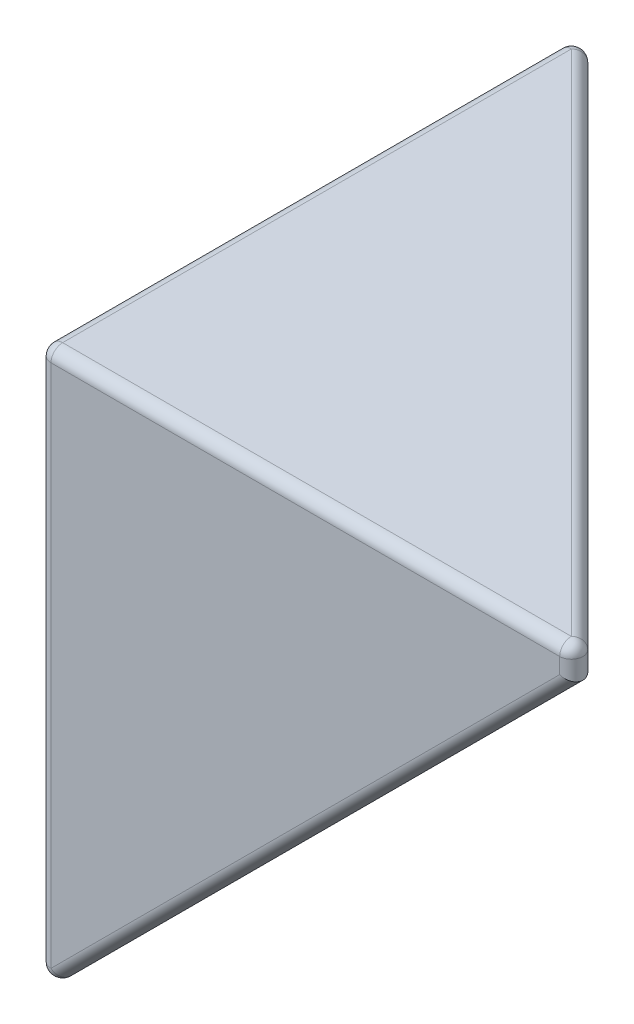
ISO-10303-21;
HEADER;
FILE_DESCRIPTION(('STEP AP214'),'2;1');
FILE_NAME('part.step','',(''),(''),'','','');
FILE_SCHEMA(('AUTOMOTIVE_DESIGN { 1 0 10303 214 1 1 1 1 }'));
ENDSEC;
DATA;
#1=APPLICATION_CONTEXT('core data for automotive mechanical design processes');
#2=APPLICATION_PROTOCOL_DEFINITION('international standard','automotive_design',2000,#1);
#3=PRODUCT_CONTEXT('',#1,'mechanical');
#4=PRODUCT('Part','Part','',(#3));
#5=PRODUCT_RELATED_PRODUCT_CATEGORY('part','',(#4));
#6=PRODUCT_DEFINITION_FORMATION('','',#4);
#7=PRODUCT_DEFINITION_CONTEXT('part definition',#1,'design');
#8=PRODUCT_DEFINITION('design','',#6,#7);
#9=PRODUCT_DEFINITION_SHAPE('','',#8);
#10=(LENGTH_UNIT() NAMED_UNIT(*) SI_UNIT(.MILLI.,.METRE.));
#11=(NAMED_UNIT(*) PLANE_ANGLE_UNIT() SI_UNIT($,.RADIAN.));
#12=(NAMED_UNIT(*) SI_UNIT($,.STERADIAN.) SOLID_ANGLE_UNIT());
#13=UNCERTAINTY_MEASURE_WITH_UNIT(LENGTH_MEASURE(1.E-05),#10,'distance_accuracy_value','');
#14=(GEOMETRIC_REPRESENTATION_CONTEXT(3) GLOBAL_UNCERTAINTY_ASSIGNED_CONTEXT((#13)) GLOBAL_UNIT_ASSIGNED_CONTEXT((#10,
#11,#12)) REPRESENTATION_CONTEXT('',''));
#15=CARTESIAN_POINT('',(0.,0.,0.));
#16=DIRECTION('',(0.,0.,1.));
#17=DIRECTION('',(1.,0.,0.));
#18=AXIS2_PLACEMENT_3D('',#15,#16,#17);
#19=CARTESIAN_POINT('',(0.,0.,-10.));
#20=DIRECTION('',(0.,0.,-1.));
#21=DIRECTION('',(-1.,0.,0.));
#22=AXIS2_PLACEMENT_3D('',#19,#20,#21);
#23=PLANE('',#22);
#24=DIRECTION('',(-0.707106781186544,-0.707106781186551,0.));
#25=VECTOR('',#24,1.);
#26=CARTESIAN_POINT('',(10.,-129.421356237311,-10.));
#27=LINE('',#26,#25);
#28=CARTESIAN_POINT('',(131.421356237309,-8.,-10.));
#29=VERTEX_POINT('',#28);
#30=CARTESIAN_POINT('',(10.,-129.421356237311,-10.));
#31=VERTEX_POINT('',#30);
#32=EDGE_CURVE('E150',#29,#31,#27,.T.);
#33=ORIENTED_EDGE('',*,*,#32,.T.);
#34=DIRECTION('',(0.,-1.,0.));
#35=VECTOR('',#34,1.);
#36=CARTESIAN_POINT('',(10.,-129.421356237311,-10.));
#37=LINE('',#36,#35);
#38=CARTESIAN_POINT('',(10.,-8.,-10.));
#39=VERTEX_POINT('',#38);
#40=EDGE_CURVE('E138',#39,#31,#37,.T.);
#41=ORIENTED_EDGE('',*,*,#40,.F.);
#42=DIRECTION('',(1.,0.,0.));
#43=VECTOR('',#42,1.);
#44=CARTESIAN_POINT('',(10.,-8.,-10.));
#45=LINE('',#44,#43);
#46=EDGE_CURVE('E143',#39,#29,#45,.T.);
#47=ORIENTED_EDGE('',*,*,#46,.T.);
#48=EDGE_LOOP('',(#33,#41,#47));
#49=FACE_BOUND('',#48,.T.);
#50=ADVANCED_FACE('F45',(#49),#23,.T.);
#51=CARTESIAN_POINT('',(10.,0.,0.));
#52=DIRECTION('',(-1.,0.,0.));
#53=DIRECTION('',(0.,-1.,0.));
#54=AXIS2_PLACEMENT_3D('',#51,#52,#53);
#55=PLANE('',#54);
#56=DIRECTION('',(0.,0.707106781186552,-0.707106781186543));
#57=VECTOR('',#56,1.);
#58=CARTESIAN_POINT('',(10.,-8.00000000000004,-131.42135623731));
#59=LINE('',#58,#57);
#60=CARTESIAN_POINT('',(9.99999999999999,-8.,-131.42135623731));
#61=VERTEX_POINT('',#60);
#62=EDGE_CURVE('E153',#31,#61,#59,.T.);
#63=ORIENTED_EDGE('',*,*,#62,.T.);
#64=DIRECTION('',(0.,0.,1.));
#65=VECTOR('',#64,1.);
#66=CARTESIAN_POINT('',(10.,-8.,-10.));
#67=LINE('',#66,#65);
#68=EDGE_CURVE('E146',#61,#39,#67,.T.);
#69=ORIENTED_EDGE('',*,*,#68,.T.);
#70=ORIENTED_EDGE('',*,*,#40,.T.);
#71=EDGE_LOOP('',(#63,#69,#70));
#72=FACE_BOUND('',#71,.T.);
#73=ADVANCED_FACE('F323',(#72),#55,.F.);
#74=CARTESIAN_POINT('',(0.,0.,0.));
#75=DIRECTION('',(1.,0.,0.));
#76=DIRECTION('',(0.,0.,-1.));
#77=AXIS2_PLACEMENT_3D('',#74,#75,#76);
#78=PLANE('',#77);
#79=DIRECTION('',(0.,-0.707106781186551,0.707106781186544));
#80=VECTOR('',#79,1.);
#81=CARTESIAN_POINT('',(0.,-145.323280025957,4.09807621135205));
#82=LINE('',#81,#80);
#83=CARTESIAN_POINT('',(0.,-7.04648826441301,-134.17871555019));
#84=VERTEX_POINT('',#83);
#85=CARTESIAN_POINT('',(0.,-138.225203814605,-3.));
#86=VERTEX_POINT('',#85);
#87=EDGE_CURVE('E180',#84,#86,#82,.T.);
#88=ORIENTED_EDGE('',*,*,#87,.T.);
#89=DIRECTION('',(0.,-1.,0.));
#90=VECTOR('',#89,1.);
#91=CARTESIAN_POINT('',(0.,0.,-3.));
#92=LINE('',#91,#90);
#93=CARTESIAN_POINT('',(0.,-3.,-3.));
#94=VERTEX_POINT('',#93);
#95=EDGE_CURVE('E187',#86,#94,#92,.F.);
#96=ORIENTED_EDGE('',*,*,#95,.T.);
#97=DIRECTION('',(0.,0.,1.));
#98=VECTOR('',#97,1.);
#99=CARTESIAN_POINT('',(0.,-3.,0.));
#100=LINE('',#99,#98);
#101=CARTESIAN_POINT('',(0.,-3.,-134.17871555019));
#102=VERTEX_POINT('',#101);
#103=EDGE_CURVE('E183',#94,#102,#100,.F.);
#104=ORIENTED_EDGE('',*,*,#103,.T.);
#105=DIRECTION('',(0.,1.,0.));
#106=VECTOR('',#105,1.);
#107=CARTESIAN_POINT('',(0.,-8.,-134.17871555019));
#108=LINE('',#107,#106);
#109=EDGE_CURVE('E177',#102,#84,#108,.F.);
#110=ORIENTED_EDGE('',*,*,#109,.T.);
#111=EDGE_LOOP('',(#88,#96,#104,#110));
#112=FACE_BOUND('',#111,.T.);
#113=ADVANCED_FACE('F321',(#112),#78,.F.);
#114=CARTESIAN_POINT('',(0.,0.,0.));
#115=DIRECTION('',(0.,0.,1.));
#116=DIRECTION('',(1.,0.,0.));
#117=AXIS2_PLACEMENT_3D('',#114,#115,#116);
#118=PLANE('',#117);
#119=DIRECTION('',(1.,0.,0.));
#120=VECTOR('',#119,1.);
#121=CARTESIAN_POINT('',(0.,-3.,0.));
#122=LINE('',#121,#120);
#123=CARTESIAN_POINT('',(134.17871555019,-3.,0.));
#124=VERTEX_POINT('',#123);
#125=CARTESIAN_POINT('',(3.,-3.,0.));
#126=VERTEX_POINT('',#125);
#127=EDGE_CURVE('E196',#124,#126,#122,.F.);
#128=ORIENTED_EDGE('',*,*,#127,.T.);
#129=DIRECTION('',(0.,-1.,0.));
#130=VECTOR('',#129,1.);
#131=CARTESIAN_POINT('',(3.,-149.421356237309,0.));
#132=LINE('',#131,#130);
#133=CARTESIAN_POINT('',(3.,-138.225203814604,0.));
#134=VERTEX_POINT('',#133);
#135=EDGE_CURVE('E200',#126,#134,#132,.T.);
#136=ORIENTED_EDGE('',*,*,#135,.T.);
#137=DIRECTION('',(0.707106781186544,0.707106781186551,0.));
#138=VECTOR('',#137,1.);
#139=CARTESIAN_POINT('',(70.6126019073023,-70.6126019073015,0.));
#140=LINE('',#139,#138);
#141=CARTESIAN_POINT('',(134.17871555019,-7.04648826441284,0.));
#142=VERTEX_POINT('',#141);
#143=EDGE_CURVE('E193',#134,#142,#140,.T.);
#144=ORIENTED_EDGE('',*,*,#143,.T.);
#145=DIRECTION('',(0.,1.,0.));
#146=VECTOR('',#145,1.);
#147=CARTESIAN_POINT('',(134.17871555019,0.,0.));
#148=LINE('',#147,#146);
#149=EDGE_CURVE('E190',#142,#124,#148,.T.);
#150=ORIENTED_EDGE('',*,*,#149,.T.);
#151=EDGE_LOOP('',(#128,#136,#144,#150));
#152=FACE_BOUND('',#151,.T.);
#153=ADVANCED_FACE('F278',(#152),#118,.T.);
#154=CARTESIAN_POINT('',(49.8071187457703,-49.8071187457697,-49.8071187457702));
#155=DIRECTION('',(0.577350269189628,-0.577350269189622,-0.577350269189627));
#156=DIRECTION('',(-0.707106781186547,0.,-0.707106781186548));
#157=AXIS2_PLACEMENT_3D('',#154,#155,#156);
#158=PLANE('',#157);
#159=DIRECTION('',(-0.707106781186548,0.,-0.707106781186548));
#160=VECTOR('',#159,1.);
#161=CARTESIAN_POINT('',(0.,-8.,-141.42135623731));
#162=LINE('',#161,#160);
#163=CARTESIAN_POINT('',(136.30003589375,-8.,-5.12132034355961));
#164=VERTEX_POINT('',#163);
#165=EDGE_CURVE('E127',#164,#29,#162,.T.);
#166=ORIENTED_EDGE('',*,*,#165,.F.);
#167=CARTESIAN_POINT('',(134.17871555019,-12.2426406871195,-3.));
#168=DIRECTION('',(0.577350269189628,-0.577350269189622,-0.577350269189627));
#169=DIRECTION('',(0.408248290463861,0.816496580927729,-0.40824829046386));
#170=AXIS2_PLACEMENT_3D('',#167,#168,#169);
#171=ELLIPSE('',#170,5.19615242270667,3.);
#172=CARTESIAN_POINT('',(136.628205292973,-8.06110013676738,-4.73205080756887));
#173=VERTEX_POINT('',#172);
#174=EDGE_CURVE('E11',#164,#173,#171,.T.);
#175=ORIENTED_EDGE('',*,*,#174,.T.);
#176=DIRECTION('',(0.707106781186544,0.707106781186551,0.));
#177=VECTOR('',#176,1.);
#178=CARTESIAN_POINT('',(72.3446527148711,-72.3446527148704,-4.73205080756887));
#179=LINE('',#178,#177);
#180=CARTESIAN_POINT('',(4.73205080756888,-139.957254622173,-4.73205080756887));
#181=VERTEX_POINT('',#180);
#182=EDGE_CURVE('E55',#173,#181,#179,.F.);
#183=ORIENTED_EDGE('',*,*,#182,.T.);
#184=DIRECTION('',(0.,-0.707106781186551,0.707106781186544));
#185=VECTOR('',#184,1.);
#186=CARTESIAN_POINT('',(4.73205080756889,-5.63397459621572,-139.055330833525));
#187=LINE('',#186,#185);
#188=CARTESIAN_POINT('',(4.73205080756889,-8.06110013676757,-136.628205292973));
#189=VERTEX_POINT('',#188);
#190=EDGE_CURVE('E214',#181,#189,#187,.F.);
#191=ORIENTED_EDGE('',*,*,#190,.T.);
#192=CARTESIAN_POINT('',(3.,-12.2426406871197,-134.17871555019));
#193=DIRECTION('',(0.577350269189628,-0.577350269189622,-0.577350269189627));
#194=DIRECTION('',(-0.408248290463861,-0.816496580927729,0.40824829046386));
#195=AXIS2_PLACEMENT_3D('',#192,#193,#194);
#196=ELLIPSE('',#195,5.19615242270667,3.);
#197=CARTESIAN_POINT('',(5.12132034355967,-8.00000000000003,-136.30003589375));
#198=VERTEX_POINT('',#197);
#199=EDGE_CURVE('E211',#189,#198,#196,.T.);
#200=ORIENTED_EDGE('',*,*,#199,.T.);
#201=DIRECTION('',(-0.707106781186547,0.,-0.707106781186547));
#202=VECTOR('',#201,1.);
#203=CARTESIAN_POINT('',(0.,-8.00000000000003,-141.42135623731));
#204=LINE('',#203,#202);
#205=EDGE_CURVE('E170',#61,#198,#204,.T.);
#206=ORIENTED_EDGE('',*,*,#205,.F.);
#207=ORIENTED_EDGE('',*,*,#62,.F.);
#208=ORIENTED_EDGE('',*,*,#32,.F.);
#209=EDGE_LOOP('',(#166,#175,#183,#191,#200,#206,#207,#208));
#210=FACE_BOUND('',#209,.T.);
#211=ADVANCED_FACE('F151',(#210),#158,.T.);
#212=CARTESIAN_POINT('',(0.,-8.,0.));
#213=DIRECTION('',(0.,-1.,0.));
#214=DIRECTION('',(0.,0.,-1.));
#215=AXIS2_PLACEMENT_3D('',#212,#213,#214);
#216=PLANE('',#215);
#217=ORIENTED_EDGE('',*,*,#46,.F.);
#218=ORIENTED_EDGE('',*,*,#68,.F.);
#219=EDGE_CURVE('E132',#29,#61,#162,.T.);
#220=ORIENTED_EDGE('',*,*,#219,.F.);
#221=EDGE_LOOP('',(#217,#218,#220));
#222=FACE_BOUND('',#221,.T.);
#223=ADVANCED_FACE('F141',(#222),#216,.T.);
#224=CARTESIAN_POINT('',(0.,-8.,-141.42135623731));
#225=DIRECTION('',(0.707106781186547,0.,-0.707106781186547));
#226=DIRECTION('',(-0.707106781186548,0.,-0.707106781186548));
#227=AXIS2_PLACEMENT_3D('',#224,#225,#226);
#228=PLANE('',#227);
#229=DIRECTION('',(-0.707106781186548,0.,-0.707106781186548));
#230=VECTOR('',#229,1.);
#231=CARTESIAN_POINT('',(141.42135623731,-3.,0.));
#232=LINE('',#231,#230);
#233=CARTESIAN_POINT('',(5.12132034355964,-3.,-136.30003589375));
#234=VERTEX_POINT('',#233);
#235=CARTESIAN_POINT('',(136.30003589375,-3.,-5.12132034355964));
#236=VERTEX_POINT('',#235);
#237=EDGE_CURVE('E206',#234,#236,#232,.F.);
#238=ORIENTED_EDGE('',*,*,#237,.T.);
#239=DIRECTION('',(0.,1.,0.));
#240=VECTOR('',#239,1.);
#241=CARTESIAN_POINT('',(136.30003589375,-8.,-5.12132034355964));
#242=LINE('',#241,#240);
#243=EDGE_CURVE('E135',#236,#164,#242,.F.);
#244=ORIENTED_EDGE('',*,*,#243,.T.);
#245=ORIENTED_EDGE('',*,*,#165,.T.);
#246=ORIENTED_EDGE('',*,*,#219,.T.);
#247=ORIENTED_EDGE('',*,*,#205,.T.);
#248=DIRECTION('',(0.,1.,0.));
#249=VECTOR('',#248,1.);
#250=CARTESIAN_POINT('',(5.12132034355964,0.,-136.30003589375));
#251=LINE('',#250,#249);
#252=EDGE_CURVE('E203',#198,#234,#251,.T.);
#253=ORIENTED_EDGE('',*,*,#252,.T.);
#254=EDGE_LOOP('',(#238,#244,#245,#246,#247,#253));
#255=FACE_BOUND('',#254,.T.);
#256=ADVANCED_FACE('F130',(#255),#228,.T.);
#257=CARTESIAN_POINT('',(0.,0.,0.));
#258=DIRECTION('',(0.,-1.,0.));
#259=DIRECTION('',(0.,0.,-1.));
#260=AXIS2_PLACEMENT_3D('',#257,#258,#259);
#261=PLANE('',#260);
#262=DIRECTION('',(-0.707106781186548,0.,-0.707106781186548));
#263=VECTOR('',#262,1.);
#264=CARTESIAN_POINT('',(-2.12132034355963,0.,-139.30003589375));
#265=LINE('',#264,#263);
#266=CARTESIAN_POINT('',(134.17871555019,0.,-3.));
#267=VERTEX_POINT('',#266);
#268=CARTESIAN_POINT('',(3.,0.,-134.17871555019));
#269=VERTEX_POINT('',#268);
#270=EDGE_CURVE('E166',#267,#269,#265,.T.);
#271=ORIENTED_EDGE('',*,*,#270,.T.);
#272=DIRECTION('',(0.,0.,1.));
#273=VECTOR('',#272,1.);
#274=CARTESIAN_POINT('',(3.,0.,0.));
#275=LINE('',#274,#273);
#276=CARTESIAN_POINT('',(3.,0.,-3.));
#277=VERTEX_POINT('',#276);
#278=EDGE_CURVE('E173',#269,#277,#275,.T.);
#279=ORIENTED_EDGE('',*,*,#278,.T.);
#280=DIRECTION('',(1.,0.,0.));
#281=VECTOR('',#280,1.);
#282=CARTESIAN_POINT('',(141.42135623731,0.,-3.));
#283=LINE('',#282,#281);
#284=EDGE_CURVE('E169',#277,#267,#283,.T.);
#285=ORIENTED_EDGE('',*,*,#284,.T.);
#286=EDGE_LOOP('',(#271,#279,#285));
#287=FACE_BOUND('',#286,.T.);
#288=ADVANCED_FACE('F341',(#287),#261,.F.);
#289=CARTESIAN_POINT('',(134.17871555019,0.,-3.));
#290=DIRECTION('',(0.,1.,0.));
#291=DIRECTION('',(0.,0.,1.));
#292=AXIS2_PLACEMENT_3D('',#289,#290,#291);
#293=CYLINDRICAL_SURFACE('',#292,3.);
#294=CARTESIAN_POINT('',(134.17871555019,-3.,-3.));
#295=DIRECTION('',(0.,1.,0.));
#296=DIRECTION('',(0.,0.,1.));
#297=AXIS2_PLACEMENT_3D('',#294,#295,#296);
#298=CIRCLE('',#297,3.);
#299=EDGE_CURVE('E262',#124,#236,#298,.T.);
#300=ORIENTED_EDGE('',*,*,#299,.F.);
#301=ORIENTED_EDGE('',*,*,#149,.F.);
#302=CARTESIAN_POINT('',(134.17871555019,-7.04648826441278,-3.));
#303=DIRECTION('',(0.382683432365087,0.923879532511288,0.));
#304=DIRECTION('',(-0.923879532511288,0.382683432365087,0.));
#305=AXIS2_PLACEMENT_3D('',#302,#303,#304);
#306=ELLIPSE('',#305,3.24717660087718,3.);
#307=EDGE_CURVE('E49',#173,#142,#306,.F.);
#308=ORIENTED_EDGE('',*,*,#307,.F.);
#309=ORIENTED_EDGE('',*,*,#174,.F.);
#310=ORIENTED_EDGE('',*,*,#243,.F.);
#311=EDGE_LOOP('',(#300,#301,#308,#309,#310));
#312=FACE_BOUND('',#311,.T.);
#313=ADVANCED_FACE('F47',(#312),#293,.T.);
#314=CARTESIAN_POINT('',(70.6126019073023,-70.6126019073015,-3.));
#315=DIRECTION('',(0.707106781186544,0.707106781186551,0.));
#316=DIRECTION('',(-0.707106781186551,0.707106781186544,0.));
#317=AXIS2_PLACEMENT_3D('',#314,#315,#316);
#318=CYLINDRICAL_SURFACE('',#317,3.);
#319=ORIENTED_EDGE('',*,*,#307,.T.);
#320=ORIENTED_EDGE('',*,*,#143,.F.);
#321=CARTESIAN_POINT('',(3.,-138.225203814605,-2.99999999999999));
#322=DIRECTION('',(-0.707106781186539,-0.707106781186556,0.));
#323=DIRECTION('',(0.707106781186556,-0.707106781186539,0.));
#324=AXIS2_PLACEMENT_3D('',#321,#322,#323);
#325=CIRCLE('',#324,3.);
#326=EDGE_CURVE('E259',#181,#134,#325,.T.);
#327=ORIENTED_EDGE('',*,*,#326,.F.);
#328=ORIENTED_EDGE('',*,*,#182,.F.);
#329=EDGE_LOOP('',(#319,#320,#327,#328));
#330=FACE_BOUND('',#329,.T.);
#331=ADVANCED_FACE('F273',(#330),#318,.T.);
#332=CARTESIAN_POINT('',(3.,-70.6126019073016,-70.6126019073023));
#333=DIRECTION('',(0.,0.707106781186551,-0.707106781186544));
#334=DIRECTION('',(0.,0.707106781186544,0.707106781186551));
#335=AXIS2_PLACEMENT_3D('',#332,#333,#334);
#336=CYLINDRICAL_SURFACE('',#335,3.);
#337=CARTESIAN_POINT('',(3.,-7.04648826441297,-134.17871555019));
#338=DIRECTION('',(0.,-0.923879532511288,0.382683432365088));
#339=DIRECTION('',(0.,-0.382683432365088,-0.923879532511288));
#340=AXIS2_PLACEMENT_3D('',#337,#338,#339);
#341=ELLIPSE('',#340,3.24717660087718,3.);
#342=EDGE_CURVE('E251',#189,#84,#341,.F.);
#343=ORIENTED_EDGE('',*,*,#342,.F.);
#344=ORIENTED_EDGE('',*,*,#190,.F.);
#345=CARTESIAN_POINT('',(3.,-138.225203814605,-3.));
#346=DIRECTION('',(0.,-0.707106781186551,0.707106781186544));
#347=DIRECTION('',(0.,-0.707106781186544,-0.707106781186551));
#348=AXIS2_PLACEMENT_3D('',#345,#346,#347);
#349=CIRCLE('',#348,3.);
#350=EDGE_CURVE('E255',#86,#181,#349,.T.);
#351=ORIENTED_EDGE('',*,*,#350,.F.);
#352=ORIENTED_EDGE('',*,*,#87,.F.);
#353=EDGE_LOOP('',(#343,#344,#351,#352));
#354=FACE_BOUND('',#353,.T.);
#355=ADVANCED_FACE('F293',(#354),#336,.T.);
#356=CARTESIAN_POINT('',(134.17871555019,-3.,-3.));
#357=DIRECTION('',(0.,0.,1.));
#358=DIRECTION('',(1.,0.,0.));
#359=AXIS2_PLACEMENT_3D('',#356,#357,#358);
#360=SPHERICAL_SURFACE('',#359,3.);
#361=CARTESIAN_POINT('',(134.17871555019,-3.,-3.));
#362=DIRECTION('',(1.,0.,0.));
#363=DIRECTION('',(0.,0.,-1.));
#364=AXIS2_PLACEMENT_3D('',#361,#362,#363);
#365=CIRCLE('',#364,3.);
#366=EDGE_CURVE('E244',#124,#267,#365,.F.);
#367=ORIENTED_EDGE('',*,*,#366,.F.);
#368=ORIENTED_EDGE('',*,*,#299,.T.);
#369=CARTESIAN_POINT('',(134.17871555019,-3.,-2.99999999999999));
#370=DIRECTION('',(0.707106781186549,0.,0.707106781186546));
#371=DIRECTION('',(0.707106781186546,0.,-0.707106781186549));
#372=AXIS2_PLACEMENT_3D('',#369,#370,#371);
#373=CIRCLE('',#372,3.);
#374=EDGE_CURVE('E248',#267,#236,#373,.F.);
#375=ORIENTED_EDGE('',*,*,#374,.F.);
#376=EDGE_LOOP('',(#367,#368,#375));
#377=FACE_BOUND('',#376,.T.);
#378=ADVANCED_FACE('F310',(#377),#360,.T.);
#379=CARTESIAN_POINT('',(3.,-138.225203814604,-3.));
#380=DIRECTION('',(0.,0.,1.));
#381=DIRECTION('',(1.,0.,0.));
#382=AXIS2_PLACEMENT_3D('',#379,#380,#381);
#383=SPHERICAL_SURFACE('',#382,3.);
#384=ORIENTED_EDGE('',*,*,#350,.T.);
#385=ORIENTED_EDGE('',*,*,#326,.T.);
#386=CARTESIAN_POINT('',(3.,-138.225203814604,-3.));
#387=DIRECTION('',(0.,-1.,0.));
#388=DIRECTION('',(1.,0.,0.));
#389=AXIS2_PLACEMENT_3D('',#386,#387,#388);
#390=CIRCLE('',#389,3.);
#391=EDGE_CURVE('E240',#86,#134,#390,.F.);
#392=ORIENTED_EDGE('',*,*,#391,.F.);
#393=EDGE_LOOP('',(#384,#385,#392));
#394=FACE_BOUND('',#393,.T.);
#395=ADVANCED_FACE('F288',(#394),#383,.T.);
#396=CARTESIAN_POINT('',(3.,-8.,-134.17871555019));
#397=DIRECTION('',(0.,-1.,0.));
#398=DIRECTION('',(0.,0.,-1.));
#399=AXIS2_PLACEMENT_3D('',#396,#397,#398);
#400=CYLINDRICAL_SURFACE('',#399,3.);
#401=ORIENTED_EDGE('',*,*,#342,.T.);
#402=ORIENTED_EDGE('',*,*,#109,.F.);
#403=CARTESIAN_POINT('',(2.99999999999999,-3.,-134.17871555019));
#404=DIRECTION('',(0.,1.,0.));
#405=DIRECTION('',(0.,0.,1.));
#406=AXIS2_PLACEMENT_3D('',#403,#404,#405);
#407=CIRCLE('',#406,3.);
#408=EDGE_CURVE('E236',#234,#102,#407,.T.);
#409=ORIENTED_EDGE('',*,*,#408,.F.);
#410=ORIENTED_EDGE('',*,*,#252,.F.);
#411=ORIENTED_EDGE('',*,*,#199,.F.);
#412=EDGE_LOOP('',(#401,#402,#409,#410,#411));
#413=FACE_BOUND('',#412,.T.);
#414=ADVANCED_FACE('F300',(#413),#400,.T.);
#415=CARTESIAN_POINT('',(68.5893577750951,-3.,-68.5893577750951));
#416=DIRECTION('',(0.707106781186548,0.,0.707106781186548));
#417=DIRECTION('',(0.707106781186548,0.,-0.707106781186548));
#418=AXIS2_PLACEMENT_3D('',#415,#416,#417);
#419=CYLINDRICAL_SURFACE('',#418,3.);
#420=ORIENTED_EDGE('',*,*,#374,.T.);
#421=ORIENTED_EDGE('',*,*,#237,.F.);
#422=CARTESIAN_POINT('',(3.,-3.,-134.17871555019));
#423=DIRECTION('',(-0.707106781186547,0.,-0.707106781186548));
#424=DIRECTION('',(-0.707106781186548,0.,0.707106781186547));
#425=AXIS2_PLACEMENT_3D('',#422,#423,#424);
#426=CIRCLE('',#425,3.);
#427=EDGE_CURVE('E232',#269,#234,#426,.T.);
#428=ORIENTED_EDGE('',*,*,#427,.F.);
#429=ORIENTED_EDGE('',*,*,#270,.F.);
#430=EDGE_LOOP('',(#420,#421,#428,#429));
#431=FACE_BOUND('',#430,.T.);
#432=ADVANCED_FACE('F309',(#431),#419,.T.);
#433=CARTESIAN_POINT('',(0.,-3.,-3.));
#434=DIRECTION('',(-1.,0.,0.));
#435=DIRECTION('',(0.,0.,1.));
#436=AXIS2_PLACEMENT_3D('',#433,#434,#435);
#437=CYLINDRICAL_SURFACE('',#436,3.);
#438=ORIENTED_EDGE('',*,*,#366,.T.);
#439=ORIENTED_EDGE('',*,*,#284,.F.);
#440=CARTESIAN_POINT('',(3.,-3.,-3.));
#441=DIRECTION('',(-1.,0.,0.));
#442=DIRECTION('',(0.,0.,1.));
#443=AXIS2_PLACEMENT_3D('',#440,#441,#442);
#444=CIRCLE('',#443,3.);
#445=EDGE_CURVE('E228',#126,#277,#444,.T.);
#446=ORIENTED_EDGE('',*,*,#445,.F.);
#447=ORIENTED_EDGE('',*,*,#127,.F.);
#448=EDGE_LOOP('',(#438,#439,#446,#447));
#449=FACE_BOUND('',#448,.T.);
#450=ADVANCED_FACE('F314',(#449),#437,.T.);
#451=CARTESIAN_POINT('',(3.,0.,-3.));
#452=DIRECTION('',(0.,1.,0.));
#453=DIRECTION('',(0.,0.,1.));
#454=AXIS2_PLACEMENT_3D('',#451,#452,#453);
#455=CYLINDRICAL_SURFACE('',#454,3.);
#456=ORIENTED_EDGE('',*,*,#391,.T.);
#457=ORIENTED_EDGE('',*,*,#135,.F.);
#458=CARTESIAN_POINT('',(3.,-3.,-3.));
#459=DIRECTION('',(0.,1.,0.));
#460=DIRECTION('',(0.,0.,1.));
#461=AXIS2_PLACEMENT_3D('',#458,#459,#460);
#462=CIRCLE('',#461,3.);
#463=EDGE_CURVE('E225',#94,#126,#462,.T.);
#464=ORIENTED_EDGE('',*,*,#463,.F.);
#465=ORIENTED_EDGE('',*,*,#95,.F.);
#466=EDGE_LOOP('',(#456,#457,#464,#465));
#467=FACE_BOUND('',#466,.T.);
#468=ADVANCED_FACE('F283',(#467),#455,.T.);
#469=CARTESIAN_POINT('',(3.,-3.,-134.17871555019));
#470=DIRECTION('',(0.,0.,1.));
#471=DIRECTION('',(1.,0.,0.));
#472=AXIS2_PLACEMENT_3D('',#469,#470,#471);
#473=SPHERICAL_SURFACE('',#472,3.);
#474=ORIENTED_EDGE('',*,*,#427,.T.);
#475=ORIENTED_EDGE('',*,*,#408,.T.);
#476=CARTESIAN_POINT('',(3.,-3.,-134.17871555019));
#477=DIRECTION('',(0.,0.,-1.));
#478=DIRECTION('',(-1.,0.,0.));
#479=AXIS2_PLACEMENT_3D('',#476,#477,#478);
#480=CIRCLE('',#479,3.);
#481=EDGE_CURVE('E222',#269,#102,#480,.F.);
#482=ORIENTED_EDGE('',*,*,#481,.F.);
#483=EDGE_LOOP('',(#474,#475,#482));
#484=FACE_BOUND('',#483,.T.);
#485=ADVANCED_FACE('F305',(#484),#473,.T.);
#486=CARTESIAN_POINT('',(3.,-3.,-3.));
#487=DIRECTION('',(0.,0.,1.));
#488=DIRECTION('',(1.,0.,0.));
#489=AXIS2_PLACEMENT_3D('',#486,#487,#488);
#490=SPHERICAL_SURFACE('',#489,3.);
#491=ORIENTED_EDGE('',*,*,#463,.T.);
#492=ORIENTED_EDGE('',*,*,#445,.T.);
#493=CARTESIAN_POINT('',(3.,-3.,-3.));
#494=DIRECTION('',(0.,0.,1.));
#495=DIRECTION('',(1.,0.,0.));
#496=AXIS2_PLACEMENT_3D('',#493,#494,#495);
#497=CIRCLE('',#496,3.);
#498=EDGE_CURVE('E219',#94,#277,#497,.F.);
#499=ORIENTED_EDGE('',*,*,#498,.F.);
#500=EDGE_LOOP('',(#491,#492,#499));
#501=FACE_BOUND('',#500,.T.);
#502=ADVANCED_FACE('F317',(#501),#490,.T.);
#503=CARTESIAN_POINT('',(3.,-3.,0.));
#504=DIRECTION('',(0.,0.,1.));
#505=DIRECTION('',(1.,0.,0.));
#506=AXIS2_PLACEMENT_3D('',#503,#504,#505);
#507=CYLINDRICAL_SURFACE('',#506,3.);
#508=ORIENTED_EDGE('',*,*,#481,.T.);
#509=ORIENTED_EDGE('',*,*,#103,.F.);
#510=ORIENTED_EDGE('',*,*,#498,.T.);
#511=ORIENTED_EDGE('',*,*,#278,.F.);
#512=EDGE_LOOP('',(#508,#509,#510,#511));
#513=FACE_BOUND('',#512,.T.);
#514=ADVANCED_FACE('F319',(#513),#507,.T.);
#515=CLOSED_SHELL('',(#50,#73,#113,#153,#211,#223,#256,#288,#313,#331,#355,#378,#395,#414,#432,
#450,#468,#485,#502,#514));
#516=MANIFOLD_SOLID_BREP('B2',#515);
#517=ADVANCED_BREP_SHAPE_REPRESENTATION('',(#18,#516),#14);
#518=SHAPE_DEFINITION_REPRESENTATION(#9,#517);
ENDSEC;
END-ISO-10303-21;
